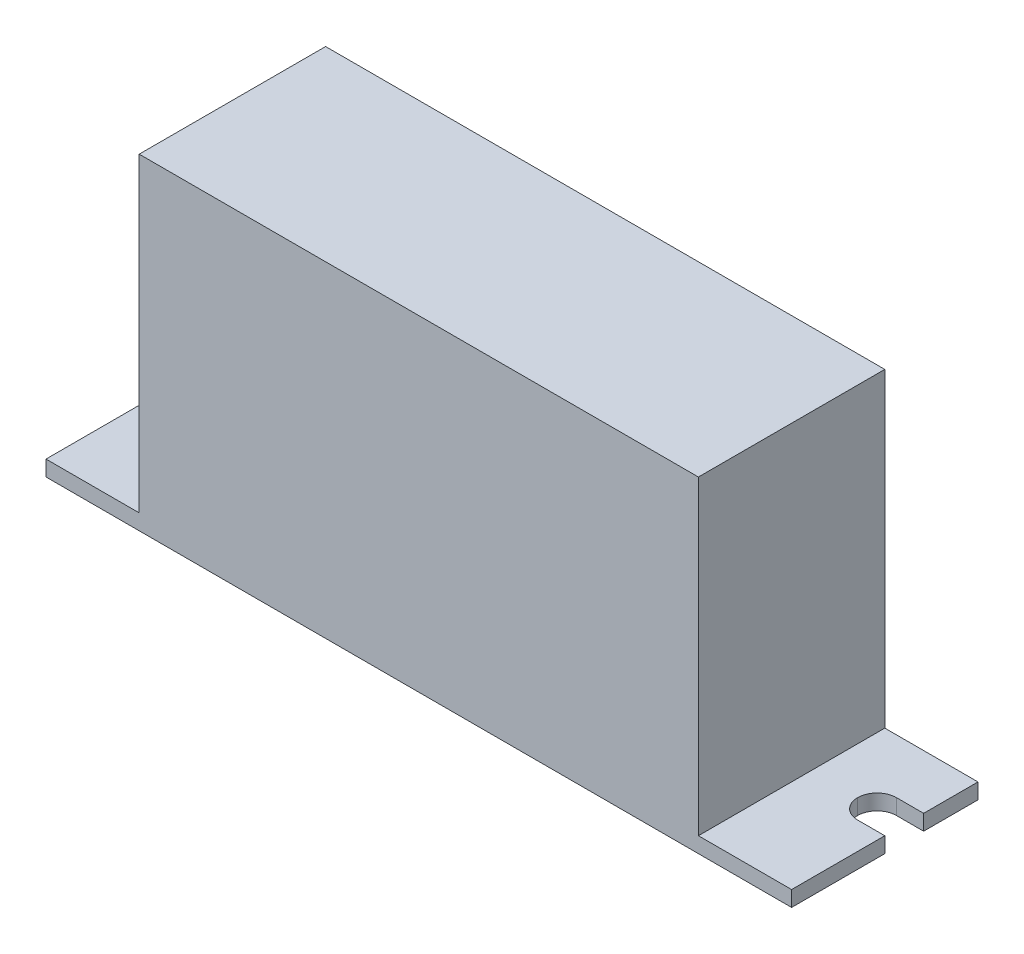
ISO-10303-21;
HEADER;
FILE_DESCRIPTION(('STEP AP214'),'2;1');
FILE_NAME('part.step','',(''),(''),'','','');
FILE_SCHEMA(('AUTOMOTIVE_DESIGN { 1 0 10303 214 1 1 1 1 }'));
ENDSEC;
DATA;
#1=APPLICATION_CONTEXT('core data for automotive mechanical design processes');
#2=APPLICATION_PROTOCOL_DEFINITION('international standard','automotive_design',2000,#1);
#3=PRODUCT_CONTEXT('',#1,'mechanical');
#4=PRODUCT('Part','Part','',(#3));
#5=PRODUCT_RELATED_PRODUCT_CATEGORY('part','',(#4));
#6=PRODUCT_DEFINITION_FORMATION('','',#4);
#7=PRODUCT_DEFINITION_CONTEXT('part definition',#1,'design');
#8=PRODUCT_DEFINITION('design','',#6,#7);
#9=PRODUCT_DEFINITION_SHAPE('','',#8);
#10=(LENGTH_UNIT() NAMED_UNIT(*) SI_UNIT(.MILLI.,.METRE.));
#11=(NAMED_UNIT(*) PLANE_ANGLE_UNIT() SI_UNIT($,.RADIAN.));
#12=(NAMED_UNIT(*) SI_UNIT($,.STERADIAN.) SOLID_ANGLE_UNIT());
#13=UNCERTAINTY_MEASURE_WITH_UNIT(LENGTH_MEASURE(1.E-05),#10,'distance_accuracy_value','');
#14=(GEOMETRIC_REPRESENTATION_CONTEXT(3) GLOBAL_UNCERTAINTY_ASSIGNED_CONTEXT((#13)) GLOBAL_UNIT_ASSIGNED_CONTEXT((#10,
#11,#12)) REPRESENTATION_CONTEXT('',''));
#15=CARTESIAN_POINT('',(0.,0.,0.));
#16=DIRECTION('',(0.,0.,1.));
#17=DIRECTION('',(1.,0.,0.));
#18=AXIS2_PLACEMENT_3D('',#15,#16,#17);
#19=CARTESIAN_POINT('',(0.,2.,24.));
#20=DIRECTION('',(1.,0.,0.));
#21=DIRECTION('',(0.,1.,0.));
#22=AXIS2_PLACEMENT_3D('',#19,#20,#21);
#23=PLANE('',#22);
#24=DIRECTION('',(0.,0.,-1.));
#25=VECTOR('',#24,1.);
#26=CARTESIAN_POINT('',(0.,0.,24.));
#27=LINE('',#26,#25);
#28=CARTESIAN_POINT('',(0.,0.,7.));
#29=VERTEX_POINT('',#28);
#30=CARTESIAN_POINT('',(0.,0.,0.));
#31=VERTEX_POINT('',#30);
#32=EDGE_CURVE('E191',#29,#31,#27,.T.);
#33=ORIENTED_EDGE('',*,*,#32,.F.);
#34=DIRECTION('',(0.,1.,0.));
#35=VECTOR('',#34,1.);
#36=CARTESIAN_POINT('',(0.,0.,7.));
#37=LINE('',#36,#35);
#38=CARTESIAN_POINT('',(0.,2.,7.));
#39=VERTEX_POINT('',#38);
#40=EDGE_CURVE('E184',#29,#39,#37,.T.);
#41=ORIENTED_EDGE('',*,*,#40,.T.);
#42=DIRECTION('',(0.,0.,-1.));
#43=VECTOR('',#42,1.);
#44=CARTESIAN_POINT('',(0.,2.,24.));
#45=LINE('',#44,#43);
#46=CARTESIAN_POINT('',(0.,2.,0.));
#47=VERTEX_POINT('',#46);
#48=EDGE_CURVE('E270',#39,#47,#45,.T.);
#49=ORIENTED_EDGE('',*,*,#48,.T.);
#50=DIRECTION('',(0.,-1.,0.));
#51=VECTOR('',#50,1.);
#52=CARTESIAN_POINT('',(0.,2.,0.));
#53=LINE('',#52,#51);
#54=EDGE_CURVE('E242',#47,#31,#53,.T.);
#55=ORIENTED_EDGE('',*,*,#54,.T.);
#56=EDGE_LOOP('',(#33,#41,#49,#55));
#57=FACE_BOUND('',#56,.T.);
#58=ADVANCED_FACE('F39',(#57),#23,.F.);
#59=CARTESIAN_POINT('',(96.,0.,24.));
#60=DIRECTION('',(-1.,0.,0.));
#61=DIRECTION('',(0.,-1.,0.));
#62=AXIS2_PLACEMENT_3D('',#59,#60,#61);
#63=PLANE('',#62);
#64=DIRECTION('',(0.,0.,-1.));
#65=VECTOR('',#64,1.);
#66=CARTESIAN_POINT('',(96.,0.,24.));
#67=LINE('',#66,#65);
#68=CARTESIAN_POINT('',(96.,0.,24.));
#69=VERTEX_POINT('',#68);
#70=CARTESIAN_POINT('',(96.,0.,12.));
#71=VERTEX_POINT('',#70);
#72=EDGE_CURVE('E196',#69,#71,#67,.T.);
#73=ORIENTED_EDGE('',*,*,#72,.T.);
#74=DIRECTION('',(0.,1.,0.));
#75=VECTOR('',#74,1.);
#76=CARTESIAN_POINT('',(96.,0.,12.));
#77=LINE('',#76,#75);
#78=CARTESIAN_POINT('',(96.,1.99999999999995,12.));
#79=VERTEX_POINT('',#78);
#80=EDGE_CURVE('E217',#71,#79,#77,.T.);
#81=ORIENTED_EDGE('',*,*,#80,.T.);
#82=DIRECTION('',(0.,0.,-1.));
#83=VECTOR('',#82,1.);
#84=CARTESIAN_POINT('',(96.,2.00000000000002,24.));
#85=LINE('',#84,#83);
#86=CARTESIAN_POINT('',(96.,2.00000000000002,24.));
#87=VERTEX_POINT('',#86);
#88=EDGE_CURVE('E302',#87,#79,#85,.T.);
#89=ORIENTED_EDGE('',*,*,#88,.F.);
#90=DIRECTION('',(0.,1.,0.));
#91=VECTOR('',#90,1.);
#92=CARTESIAN_POINT('',(96.,0.,24.));
#93=LINE('',#92,#91);
#94=EDGE_CURVE('E258',#69,#87,#93,.T.);
#95=ORIENTED_EDGE('',*,*,#94,.F.);
#96=EDGE_LOOP('',(#73,#81,#89,#95));
#97=FACE_BOUND('',#96,.T.);
#98=ADVANCED_FACE('F341',(#97),#63,.F.);
#99=CARTESIAN_POINT('',(0.,2.,24.));
#100=VERTEX_POINT('',#99);
#101=CARTESIAN_POINT('',(0.,2.,12.));
#102=VERTEX_POINT('',#101);
#103=EDGE_CURVE('E183',#100,#102,#45,.T.);
#104=ORIENTED_EDGE('',*,*,#103,.T.);
#105=DIRECTION('',(0.,1.,0.));
#106=VECTOR('',#105,1.);
#107=CARTESIAN_POINT('',(0.,0.,12.));
#108=LINE('',#107,#106);
#109=CARTESIAN_POINT('',(0.,0.,12.));
#110=VERTEX_POINT('',#109);
#111=EDGE_CURVE('E168',#110,#102,#108,.T.);
#112=ORIENTED_EDGE('',*,*,#111,.F.);
#113=CARTESIAN_POINT('',(0.,0.,24.));
#114=VERTEX_POINT('',#113);
#115=EDGE_CURVE('E181',#114,#110,#27,.T.);
#116=ORIENTED_EDGE('',*,*,#115,.F.);
#117=DIRECTION('',(0.,-1.,0.));
#118=VECTOR('',#117,1.);
#119=CARTESIAN_POINT('',(0.,2.,24.));
#120=LINE('',#119,#118);
#121=EDGE_CURVE('E254',#100,#114,#120,.T.);
#122=ORIENTED_EDGE('',*,*,#121,.F.);
#123=EDGE_LOOP('',(#104,#112,#116,#122));
#124=FACE_BOUND('',#123,.T.);
#125=ADVANCED_FACE('F179',(#124),#23,.F.);
#126=CARTESIAN_POINT('',(0.,0.,24.));
#127=DIRECTION('',(0.,1.,0.));
#128=DIRECTION('',(0.,0.,1.));
#129=AXIS2_PLACEMENT_3D('',#126,#127,#128);
#130=PLANE('',#129);
#131=CARTESIAN_POINT('',(3.5,0.,9.5));
#132=DIRECTION('',(0.,1.,0.));
#133=DIRECTION('',(0.,0.,1.));
#134=AXIS2_PLACEMENT_3D('',#131,#132,#133);
#135=CIRCLE('',#134,2.5);
#136=CARTESIAN_POINT('',(3.5,0.,12.));
#137=VERTEX_POINT('',#136);
#138=CARTESIAN_POINT('',(6.,0.,9.5));
#139=VERTEX_POINT('',#138);
#140=EDGE_CURVE('E55',#137,#139,#135,.T.);
#141=ORIENTED_EDGE('',*,*,#140,.T.);
#142=CARTESIAN_POINT('',(3.5,0.,9.5));
#143=DIRECTION('',(0.,1.,0.));
#144=DIRECTION('',(0.,0.,1.));
#145=AXIS2_PLACEMENT_3D('',#142,#143,#144);
#146=CIRCLE('',#145,2.5);
#147=CARTESIAN_POINT('',(3.5,0.,7.));
#148=VERTEX_POINT('',#147);
#149=EDGE_CURVE('E11',#139,#148,#146,.T.);
#150=ORIENTED_EDGE('',*,*,#149,.T.);
#151=DIRECTION('',(-1.,0.,0.));
#152=VECTOR('',#151,1.);
#153=CARTESIAN_POINT('',(0.,0.,7.));
#154=LINE('',#153,#152);
#155=EDGE_CURVE('E173',#148,#29,#154,.T.);
#156=ORIENTED_EDGE('',*,*,#155,.T.);
#157=ORIENTED_EDGE('',*,*,#32,.T.);
#158=DIRECTION('',(1.,0.,0.));
#159=VECTOR('',#158,1.);
#160=CARTESIAN_POINT('',(0.,0.,0.));
#161=LINE('',#160,#159);
#162=CARTESIAN_POINT('',(96.,0.,0.));
#163=VERTEX_POINT('',#162);
#164=EDGE_CURVE('E273',#31,#163,#161,.T.);
#165=ORIENTED_EDGE('',*,*,#164,.T.);
#166=CARTESIAN_POINT('',(96.,0.,7.));
#167=VERTEX_POINT('',#166);
#168=EDGE_CURVE('E304',#167,#163,#67,.T.);
#169=ORIENTED_EDGE('',*,*,#168,.F.);
#170=DIRECTION('',(-1.,0.,0.));
#171=VECTOR('',#170,1.);
#172=CARTESIAN_POINT('',(96.,0.,7.));
#173=LINE('',#172,#171);
#174=CARTESIAN_POINT('',(92.5,0.,7.));
#175=VERTEX_POINT('',#174);
#176=EDGE_CURVE('E248',#167,#175,#173,.T.);
#177=ORIENTED_EDGE('',*,*,#176,.T.);
#178=CARTESIAN_POINT('',(92.5,0.,9.5));
#179=DIRECTION('',(0.,1.,0.));
#180=DIRECTION('',(0.,0.,1.));
#181=AXIS2_PLACEMENT_3D('',#178,#179,#180);
#182=CIRCLE('',#181,2.5);
#183=CARTESIAN_POINT('',(90.,0.,9.5));
#184=VERTEX_POINT('',#183);
#185=EDGE_CURVE('E210',#175,#184,#182,.T.);
#186=ORIENTED_EDGE('',*,*,#185,.T.);
#187=CARTESIAN_POINT('',(92.5,0.,9.5));
#188=DIRECTION('',(0.,1.,0.));
#189=DIRECTION('',(0.,0.,1.));
#190=AXIS2_PLACEMENT_3D('',#187,#188,#189);
#191=CIRCLE('',#190,2.5);
#192=CARTESIAN_POINT('',(92.5,0.,12.));
#193=VERTEX_POINT('',#192);
#194=EDGE_CURVE('E206',#184,#193,#191,.T.);
#195=ORIENTED_EDGE('',*,*,#194,.T.);
#196=DIRECTION('',(1.,0.,0.));
#197=VECTOR('',#196,1.);
#198=CARTESIAN_POINT('',(96.,0.,12.));
#199=LINE('',#198,#197);
#200=EDGE_CURVE('E244',#193,#71,#199,.T.);
#201=ORIENTED_EDGE('',*,*,#200,.T.);
#202=ORIENTED_EDGE('',*,*,#72,.F.);
#203=DIRECTION('',(1.,0.,0.));
#204=VECTOR('',#203,1.);
#205=CARTESIAN_POINT('',(0.,0.,24.));
#206=LINE('',#205,#204);
#207=EDGE_CURVE('E188',#114,#69,#206,.T.);
#208=ORIENTED_EDGE('',*,*,#207,.F.);
#209=ORIENTED_EDGE('',*,*,#115,.T.);
#210=DIRECTION('',(1.,0.,0.));
#211=VECTOR('',#210,1.);
#212=CARTESIAN_POINT('',(0.,0.,12.));
#213=LINE('',#212,#211);
#214=EDGE_CURVE('E164',#110,#137,#213,.T.);
#215=ORIENTED_EDGE('',*,*,#214,.T.);
#216=EDGE_LOOP('',(#141,#150,#156,#157,#165,#169,#177,#186,#195,#201,#202,#208,#209,#215));
#217=FACE_BOUND('',#216,.T.);
#218=ADVANCED_FACE('F186',(#217),#130,.F.);
#219=CARTESIAN_POINT('',(96.,2.00000000000002,7.));
#220=VERTEX_POINT('',#219);
#221=CARTESIAN_POINT('',(96.,2.00000000000002,0.));
#222=VERTEX_POINT('',#221);
#223=EDGE_CURVE('E301',#220,#222,#85,.T.);
#224=ORIENTED_EDGE('',*,*,#223,.F.);
#225=DIRECTION('',(0.,1.,0.));
#226=VECTOR('',#225,1.);
#227=CARTESIAN_POINT('',(96.,0.,7.));
#228=LINE('',#227,#226);
#229=EDGE_CURVE('E222',#167,#220,#228,.T.);
#230=ORIENTED_EDGE('',*,*,#229,.F.);
#231=ORIENTED_EDGE('',*,*,#168,.T.);
#232=DIRECTION('',(0.,1.,0.));
#233=VECTOR('',#232,1.);
#234=CARTESIAN_POINT('',(96.,0.,0.));
#235=LINE('',#234,#233);
#236=EDGE_CURVE('E276',#163,#222,#235,.T.);
#237=ORIENTED_EDGE('',*,*,#236,.T.);
#238=EDGE_LOOP('',(#224,#230,#231,#237));
#239=FACE_BOUND('',#238,.T.);
#240=ADVANCED_FACE('F317',(#239),#63,.F.);
#241=CARTESIAN_POINT('',(96.,2.00000000000002,24.));
#242=DIRECTION('',(0.,-1.,0.));
#243=DIRECTION('',(1.,0.,0.));
#244=AXIS2_PLACEMENT_3D('',#241,#242,#243);
#245=PLANE('',#244);
#246=ORIENTED_EDGE('',*,*,#88,.T.);
#247=DIRECTION('',(1.,0.,0.));
#248=VECTOR('',#247,1.);
#249=CARTESIAN_POINT('',(96.,1.99999999999995,12.));
#250=LINE('',#249,#248);
#251=CARTESIAN_POINT('',(92.5,1.99999999999995,12.));
#252=VERTEX_POINT('',#251);
#253=EDGE_CURVE('E246',#252,#79,#250,.T.);
#254=ORIENTED_EDGE('',*,*,#253,.F.);
#255=CARTESIAN_POINT('',(92.5,2.00000000000001,9.5));
#256=DIRECTION('',(0.,-1.,0.));
#257=DIRECTION('',(1.,0.,0.));
#258=AXIS2_PLACEMENT_3D('',#255,#256,#257);
#259=CIRCLE('',#258,2.5);
#260=CARTESIAN_POINT('',(90.,1.99999999999995,9.5));
#261=VERTEX_POINT('',#260);
#262=EDGE_CURVE('E204',#252,#261,#259,.T.);
#263=ORIENTED_EDGE('',*,*,#262,.T.);
#264=CARTESIAN_POINT('',(92.5,2.00000000000001,9.5));
#265=DIRECTION('',(0.,-1.,0.));
#266=DIRECTION('',(1.,0.,0.));
#267=AXIS2_PLACEMENT_3D('',#264,#265,#266);
#268=CIRCLE('',#267,2.5);
#269=CARTESIAN_POINT('',(92.5,1.99999999999995,7.));
#270=VERTEX_POINT('',#269);
#271=EDGE_CURVE('E208',#261,#270,#268,.T.);
#272=ORIENTED_EDGE('',*,*,#271,.T.);
#273=DIRECTION('',(-1.,0.,0.));
#274=VECTOR('',#273,1.);
#275=CARTESIAN_POINT('',(96.,1.99999999999995,7.));
#276=LINE('',#275,#274);
#277=EDGE_CURVE('E240',#220,#270,#276,.T.);
#278=ORIENTED_EDGE('',*,*,#277,.F.);
#279=ORIENTED_EDGE('',*,*,#223,.T.);
#280=DIRECTION('',(-1.,0.,0.));
#281=VECTOR('',#280,1.);
#282=CARTESIAN_POINT('',(96.,2.00000000000002,0.));
#283=LINE('',#282,#281);
#284=CARTESIAN_POINT('',(84.,1.99999999999999,0.));
#285=VERTEX_POINT('',#284);
#286=EDGE_CURVE('E279',#222,#285,#283,.T.);
#287=ORIENTED_EDGE('',*,*,#286,.T.);
#288=DIRECTION('',(0.,0.,-1.));
#289=VECTOR('',#288,1.);
#290=CARTESIAN_POINT('',(84.,1.99999999999999,24.));
#291=LINE('',#290,#289);
#292=CARTESIAN_POINT('',(84.,1.99999999999999,24.));
#293=VERTEX_POINT('',#292);
#294=EDGE_CURVE('E299',#293,#285,#291,.T.);
#295=ORIENTED_EDGE('',*,*,#294,.F.);
#296=DIRECTION('',(-1.,0.,0.));
#297=VECTOR('',#296,1.);
#298=CARTESIAN_POINT('',(96.,2.00000000000002,24.));
#299=LINE('',#298,#297);
#300=EDGE_CURVE('E260',#87,#293,#299,.T.);
#301=ORIENTED_EDGE('',*,*,#300,.F.);
#302=EDGE_LOOP('',(#246,#254,#263,#272,#278,#279,#287,#295,#301));
#303=FACE_BOUND('',#302,.T.);
#304=ADVANCED_FACE('F311',(#303),#245,.F.);
#305=CARTESIAN_POINT('',(84.,1.99999999999999,24.));
#306=DIRECTION('',(-1.,0.,0.));
#307=DIRECTION('',(0.,0.,1.));
#308=AXIS2_PLACEMENT_3D('',#305,#306,#307);
#309=PLANE('',#308);
#310=DIRECTION('',(0.,1.,0.));
#311=VECTOR('',#310,1.);
#312=CARTESIAN_POINT('',(84.,1.99999999999999,0.));
#313=LINE('',#312,#311);
#314=CARTESIAN_POINT('',(84.,42.,0.));
#315=VERTEX_POINT('',#314);
#316=EDGE_CURVE('E281',#285,#315,#313,.T.);
#317=ORIENTED_EDGE('',*,*,#316,.T.);
#318=DIRECTION('',(0.,0.,-1.));
#319=VECTOR('',#318,1.);
#320=CARTESIAN_POINT('',(84.,42.,24.));
#321=LINE('',#320,#319);
#322=CARTESIAN_POINT('',(84.,42.,24.));
#323=VERTEX_POINT('',#322);
#324=EDGE_CURVE('E296',#323,#315,#321,.T.);
#325=ORIENTED_EDGE('',*,*,#324,.F.);
#326=DIRECTION('',(0.,1.,0.));
#327=VECTOR('',#326,1.);
#328=CARTESIAN_POINT('',(84.,1.99999999999999,24.));
#329=LINE('',#328,#327);
#330=EDGE_CURVE('E262',#293,#323,#329,.T.);
#331=ORIENTED_EDGE('',*,*,#330,.F.);
#332=ORIENTED_EDGE('',*,*,#294,.T.);
#333=EDGE_LOOP('',(#317,#325,#331,#332));
#334=FACE_BOUND('',#333,.T.);
#335=ADVANCED_FACE('F328',(#334),#309,.F.);
#336=CARTESIAN_POINT('',(84.,42.,24.));
#337=DIRECTION('',(0.,-1.,0.));
#338=DIRECTION('',(1.,0.,0.));
#339=AXIS2_PLACEMENT_3D('',#336,#337,#338);
#340=PLANE('',#339);
#341=DIRECTION('',(-1.,0.,0.));
#342=VECTOR('',#341,1.);
#343=CARTESIAN_POINT('',(84.,42.,0.));
#344=LINE('',#343,#342);
#345=CARTESIAN_POINT('',(12.,42.,0.));
#346=VERTEX_POINT('',#345);
#347=EDGE_CURVE('E283',#315,#346,#344,.T.);
#348=ORIENTED_EDGE('',*,*,#347,.T.);
#349=DIRECTION('',(0.,0.,-1.));
#350=VECTOR('',#349,1.);
#351=CARTESIAN_POINT('',(12.,42.,24.));
#352=LINE('',#351,#350);
#353=CARTESIAN_POINT('',(12.,42.,24.));
#354=VERTEX_POINT('',#353);
#355=EDGE_CURVE('E293',#354,#346,#352,.T.);
#356=ORIENTED_EDGE('',*,*,#355,.F.);
#357=DIRECTION('',(-1.,0.,0.));
#358=VECTOR('',#357,1.);
#359=CARTESIAN_POINT('',(84.,42.,24.));
#360=LINE('',#359,#358);
#361=EDGE_CURVE('E264',#323,#354,#360,.T.);
#362=ORIENTED_EDGE('',*,*,#361,.F.);
#363=ORIENTED_EDGE('',*,*,#324,.T.);
#364=EDGE_LOOP('',(#348,#356,#362,#363));
#365=FACE_BOUND('',#364,.T.);
#366=ADVANCED_FACE('F332',(#365),#340,.F.);
#367=CARTESIAN_POINT('',(12.,42.,24.));
#368=DIRECTION('',(1.,0.,0.));
#369=DIRECTION('',(0.,1.,0.));
#370=AXIS2_PLACEMENT_3D('',#367,#368,#369);
#371=PLANE('',#370);
#372=DIRECTION('',(0.,-1.,0.));
#373=VECTOR('',#372,1.);
#374=CARTESIAN_POINT('',(12.,42.,0.));
#375=LINE('',#374,#373);
#376=CARTESIAN_POINT('',(12.,1.99999999999999,0.));
#377=VERTEX_POINT('',#376);
#378=EDGE_CURVE('E285',#346,#377,#375,.T.);
#379=ORIENTED_EDGE('',*,*,#378,.T.);
#380=DIRECTION('',(0.,0.,-1.));
#381=VECTOR('',#380,1.);
#382=CARTESIAN_POINT('',(12.,1.99999999999999,24.));
#383=LINE('',#382,#381);
#384=CARTESIAN_POINT('',(12.,1.99999999999999,24.));
#385=VERTEX_POINT('',#384);
#386=EDGE_CURVE('E290',#385,#377,#383,.T.);
#387=ORIENTED_EDGE('',*,*,#386,.F.);
#388=DIRECTION('',(0.,-1.,0.));
#389=VECTOR('',#388,1.);
#390=CARTESIAN_POINT('',(12.,42.,24.));
#391=LINE('',#390,#389);
#392=EDGE_CURVE('E266',#354,#385,#391,.T.);
#393=ORIENTED_EDGE('',*,*,#392,.F.);
#394=ORIENTED_EDGE('',*,*,#355,.T.);
#395=EDGE_LOOP('',(#379,#387,#393,#394));
#396=FACE_BOUND('',#395,.T.);
#397=ADVANCED_FACE('F360',(#396),#371,.F.);
#398=CARTESIAN_POINT('',(12.,1.99999999999999,24.));
#399=DIRECTION('',(0.,-1.,0.));
#400=DIRECTION('',(1.,0.,0.));
#401=AXIS2_PLACEMENT_3D('',#398,#399,#400);
#402=PLANE('',#401);
#403=ORIENTED_EDGE('',*,*,#48,.F.);
#404=DIRECTION('',(-1.,0.,0.));
#405=VECTOR('',#404,1.);
#406=CARTESIAN_POINT('',(0.,2.,7.));
#407=LINE('',#406,#405);
#408=CARTESIAN_POINT('',(3.5,2.,7.));
#409=VERTEX_POINT('',#408);
#410=EDGE_CURVE('E174',#409,#39,#407,.T.);
#411=ORIENTED_EDGE('',*,*,#410,.F.);
#412=CARTESIAN_POINT('',(3.5,2.,9.5));
#413=DIRECTION('',(0.,-1.,0.));
#414=DIRECTION('',(1.,0.,0.));
#415=AXIS2_PLACEMENT_3D('',#412,#413,#414);
#416=CIRCLE('',#415,2.5);
#417=CARTESIAN_POINT('',(6.,2.,9.5));
#418=VERTEX_POINT('',#417);
#419=EDGE_CURVE('E48',#409,#418,#416,.T.);
#420=ORIENTED_EDGE('',*,*,#419,.T.);
#421=CARTESIAN_POINT('',(3.5,2.,9.5));
#422=DIRECTION('',(0.,-1.,0.));
#423=DIRECTION('',(1.,0.,0.));
#424=AXIS2_PLACEMENT_3D('',#421,#422,#423);
#425=CIRCLE('',#424,2.5);
#426=CARTESIAN_POINT('',(3.5,2.,12.));
#427=VERTEX_POINT('',#426);
#428=EDGE_CURVE('E212',#418,#427,#425,.T.);
#429=ORIENTED_EDGE('',*,*,#428,.T.);
#430=DIRECTION('',(1.,0.,0.));
#431=VECTOR('',#430,1.);
#432=CARTESIAN_POINT('',(0.,2.,12.));
#433=LINE('',#432,#431);
#434=EDGE_CURVE('E238',#102,#427,#433,.T.);
#435=ORIENTED_EDGE('',*,*,#434,.F.);
#436=ORIENTED_EDGE('',*,*,#103,.F.);
#437=DIRECTION('',(-1.,0.,0.));
#438=VECTOR('',#437,1.);
#439=CARTESIAN_POINT('',(12.,1.99999999999999,24.));
#440=LINE('',#439,#438);
#441=EDGE_CURVE('E268',#385,#100,#440,.T.);
#442=ORIENTED_EDGE('',*,*,#441,.F.);
#443=ORIENTED_EDGE('',*,*,#386,.T.);
#444=DIRECTION('',(-1.,0.,0.));
#445=VECTOR('',#444,1.);
#446=CARTESIAN_POINT('',(12.,1.99999999999999,0.));
#447=LINE('',#446,#445);
#448=EDGE_CURVE('E256',#377,#47,#447,.T.);
#449=ORIENTED_EDGE('',*,*,#448,.T.);
#450=EDGE_LOOP('',(#403,#411,#420,#429,#435,#436,#442,#443,#449));
#451=FACE_BOUND('',#450,.T.);
#452=ADVANCED_FACE('F357',(#451),#402,.F.);
#453=CARTESIAN_POINT('',(0.,0.,24.));
#454=DIRECTION('',(0.,0.,1.));
#455=DIRECTION('',(1.,0.,0.));
#456=AXIS2_PLACEMENT_3D('',#453,#454,#455);
#457=PLANE('',#456);
#458=ORIENTED_EDGE('',*,*,#121,.T.);
#459=ORIENTED_EDGE('',*,*,#207,.T.);
#460=ORIENTED_EDGE('',*,*,#94,.T.);
#461=ORIENTED_EDGE('',*,*,#300,.T.);
#462=ORIENTED_EDGE('',*,*,#330,.T.);
#463=ORIENTED_EDGE('',*,*,#361,.T.);
#464=ORIENTED_EDGE('',*,*,#392,.T.);
#465=ORIENTED_EDGE('',*,*,#441,.T.);
#466=EDGE_LOOP('',(#458,#459,#460,#461,#462,#463,#464,#465));
#467=FACE_BOUND('',#466,.T.);
#468=ADVANCED_FACE('F336',(#467),#457,.T.);
#469=CARTESIAN_POINT('',(0.,0.,0.));
#470=DIRECTION('',(0.,0.,1.));
#471=DIRECTION('',(1.,0.,0.));
#472=AXIS2_PLACEMENT_3D('',#469,#470,#471);
#473=PLANE('',#472);
#474=ORIENTED_EDGE('',*,*,#54,.F.);
#475=ORIENTED_EDGE('',*,*,#448,.F.);
#476=ORIENTED_EDGE('',*,*,#378,.F.);
#477=ORIENTED_EDGE('',*,*,#347,.F.);
#478=ORIENTED_EDGE('',*,*,#316,.F.);
#479=ORIENTED_EDGE('',*,*,#286,.F.);
#480=ORIENTED_EDGE('',*,*,#236,.F.);
#481=ORIENTED_EDGE('',*,*,#164,.F.);
#482=EDGE_LOOP('',(#474,#475,#476,#477,#478,#479,#480,#481));
#483=FACE_BOUND('',#482,.T.);
#484=ADVANCED_FACE('F323',(#483),#473,.F.);
#485=CARTESIAN_POINT('',(0.,0.,7.));
#486=DIRECTION('',(0.,0.,-1.));
#487=DIRECTION('',(-1.,0.,0.));
#488=AXIS2_PLACEMENT_3D('',#485,#486,#487);
#489=PLANE('',#488);
#490=ORIENTED_EDGE('',*,*,#155,.F.);
#491=DIRECTION('',(0.,1.,0.));
#492=VECTOR('',#491,1.);
#493=CARTESIAN_POINT('',(3.5,2.,7.));
#494=LINE('',#493,#492);
#495=EDGE_CURVE('E202',#148,#409,#494,.T.);
#496=ORIENTED_EDGE('',*,*,#495,.T.);
#497=ORIENTED_EDGE('',*,*,#410,.T.);
#498=ORIENTED_EDGE('',*,*,#40,.F.);
#499=EDGE_LOOP('',(#490,#496,#497,#498));
#500=FACE_BOUND('',#499,.T.);
#501=ADVANCED_FACE('F233',(#500),#489,.F.);
#502=CARTESIAN_POINT('',(0.,0.,12.));
#503=DIRECTION('',(0.,0.,1.));
#504=DIRECTION('',(1.,0.,0.));
#505=AXIS2_PLACEMENT_3D('',#502,#503,#504);
#506=PLANE('',#505);
#507=ORIENTED_EDGE('',*,*,#434,.T.);
#508=DIRECTION('',(0.,1.,0.));
#509=VECTOR('',#508,1.);
#510=CARTESIAN_POINT('',(3.5,0.,12.));
#511=LINE('',#510,#509);
#512=EDGE_CURVE('E171',#427,#137,#511,.F.);
#513=ORIENTED_EDGE('',*,*,#512,.T.);
#514=ORIENTED_EDGE('',*,*,#214,.F.);
#515=ORIENTED_EDGE('',*,*,#111,.T.);
#516=EDGE_LOOP('',(#507,#513,#514,#515));
#517=FACE_BOUND('',#516,.T.);
#518=ADVANCED_FACE('F167',(#517),#506,.F.);
#519=CARTESIAN_POINT('',(96.,0.,12.));
#520=DIRECTION('',(0.,0.,1.));
#521=DIRECTION('',(1.,0.,0.));
#522=AXIS2_PLACEMENT_3D('',#519,#520,#521);
#523=PLANE('',#522);
#524=ORIENTED_EDGE('',*,*,#200,.F.);
#525=DIRECTION('',(0.,1.,0.));
#526=VECTOR('',#525,1.);
#527=CARTESIAN_POINT('',(92.5,1.99999999999995,12.));
#528=LINE('',#527,#526);
#529=EDGE_CURVE('E190',#193,#252,#528,.T.);
#530=ORIENTED_EDGE('',*,*,#529,.T.);
#531=ORIENTED_EDGE('',*,*,#253,.T.);
#532=ORIENTED_EDGE('',*,*,#80,.F.);
#533=EDGE_LOOP('',(#524,#530,#531,#532));
#534=FACE_BOUND('',#533,.T.);
#535=ADVANCED_FACE('F345',(#534),#523,.F.);
#536=CARTESIAN_POINT('',(96.,0.,7.));
#537=DIRECTION('',(0.,0.,-1.));
#538=DIRECTION('',(-1.,0.,0.));
#539=AXIS2_PLACEMENT_3D('',#536,#537,#538);
#540=PLANE('',#539);
#541=ORIENTED_EDGE('',*,*,#277,.T.);
#542=DIRECTION('',(0.,1.,0.));
#543=VECTOR('',#542,1.);
#544=CARTESIAN_POINT('',(92.5,0.,7.));
#545=LINE('',#544,#543);
#546=EDGE_CURVE('E194',#270,#175,#545,.F.);
#547=ORIENTED_EDGE('',*,*,#546,.T.);
#548=ORIENTED_EDGE('',*,*,#176,.F.);
#549=ORIENTED_EDGE('',*,*,#229,.T.);
#550=EDGE_LOOP('',(#541,#547,#548,#549));
#551=FACE_BOUND('',#550,.T.);
#552=ADVANCED_FACE('F353',(#551),#540,.F.);
#553=CARTESIAN_POINT('',(92.5,0.,9.5));
#554=DIRECTION('',(0.,-1.,0.));
#555=DIRECTION('',(1.,0.,0.));
#556=AXIS2_PLACEMENT_3D('',#553,#554,#555);
#557=CYLINDRICAL_SURFACE('',#556,2.5);
#558=DIRECTION('',(0.,1.,0.));
#559=VECTOR('',#558,1.);
#560=CARTESIAN_POINT('',(90.,1.99999999999995,9.5));
#561=LINE('',#560,#559);
#562=EDGE_CURVE('E215',#184,#261,#561,.T.);
#563=ORIENTED_EDGE('',*,*,#562,.F.);
#564=ORIENTED_EDGE('',*,*,#185,.F.);
#565=ORIENTED_EDGE('',*,*,#546,.F.);
#566=ORIENTED_EDGE('',*,*,#271,.F.);
#567=EDGE_LOOP('',(#563,#564,#565,#566));
#568=FACE_BOUND('',#567,.T.);
#569=ADVANCED_FACE('F350',(#568),#557,.F.);
#570=CARTESIAN_POINT('',(92.5,0.,9.5));
#571=DIRECTION('',(0.,-1.,0.));
#572=DIRECTION('',(1.,0.,0.));
#573=AXIS2_PLACEMENT_3D('',#570,#571,#572);
#574=CYLINDRICAL_SURFACE('',#573,2.5);
#575=ORIENTED_EDGE('',*,*,#194,.F.);
#576=ORIENTED_EDGE('',*,*,#562,.T.);
#577=ORIENTED_EDGE('',*,*,#262,.F.);
#578=ORIENTED_EDGE('',*,*,#529,.F.);
#579=EDGE_LOOP('',(#575,#576,#577,#578));
#580=FACE_BOUND('',#579,.T.);
#581=ADVANCED_FACE('F473',(#580),#574,.F.);
#582=CARTESIAN_POINT('',(3.5,0.,9.5));
#583=DIRECTION('',(0.,-1.,0.));
#584=DIRECTION('',(1.,0.,0.));
#585=AXIS2_PLACEMENT_3D('',#582,#583,#584);
#586=CYLINDRICAL_SURFACE('',#585,2.5);
#587=ORIENTED_EDGE('',*,*,#495,.F.);
#588=ORIENTED_EDGE('',*,*,#149,.F.);
#589=DIRECTION('',(0.,1.,0.));
#590=VECTOR('',#589,1.);
#591=CARTESIAN_POINT('',(6.,0.,9.5));
#592=LINE('',#591,#590);
#593=EDGE_CURVE('E43',#418,#139,#592,.F.);
#594=ORIENTED_EDGE('',*,*,#593,.F.);
#595=ORIENTED_EDGE('',*,*,#419,.F.);
#596=EDGE_LOOP('',(#587,#588,#594,#595));
#597=FACE_BOUND('',#596,.T.);
#598=ADVANCED_FACE('F41',(#597),#586,.F.);
#599=CARTESIAN_POINT('',(3.5,0.,9.5));
#600=DIRECTION('',(0.,-1.,0.));
#601=DIRECTION('',(1.,0.,0.));
#602=AXIS2_PLACEMENT_3D('',#599,#600,#601);
#603=CYLINDRICAL_SURFACE('',#602,2.5);
#604=ORIENTED_EDGE('',*,*,#140,.F.);
#605=ORIENTED_EDGE('',*,*,#512,.F.);
#606=ORIENTED_EDGE('',*,*,#428,.F.);
#607=ORIENTED_EDGE('',*,*,#593,.T.);
#608=EDGE_LOOP('',(#604,#605,#606,#607));
#609=FACE_BOUND('',#608,.T.);
#610=ADVANCED_FACE('F227',(#609),#603,.F.);
#611=CLOSED_SHELL('',(#58,#98,#125,#218,#240,#304,#335,#366,#397,#452,#468,#484,#501,#518,#535,
#552,#569,#581,#598,#610));
#612=MANIFOLD_SOLID_BREP('B2',#611);
#613=ADVANCED_BREP_SHAPE_REPRESENTATION('',(#18,#612),#14);
#614=SHAPE_DEFINITION_REPRESENTATION(#9,#613);
ENDSEC;
END-ISO-10303-21;
